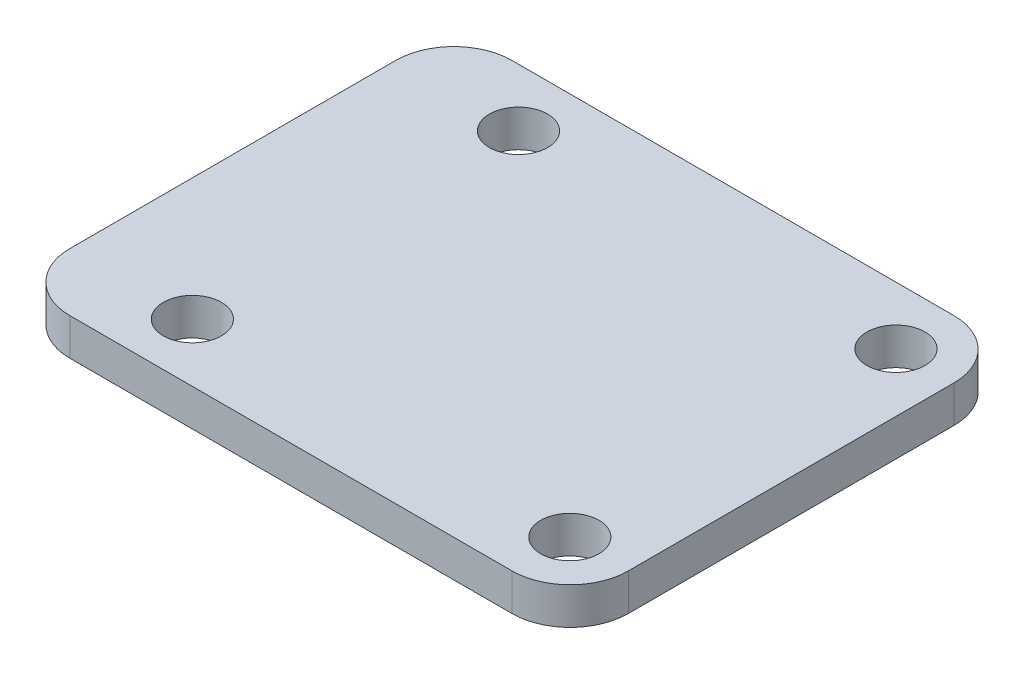
ISO-10303-21;
HEADER;
FILE_DESCRIPTION(('STEP AP214'),'2;1');
FILE_NAME('part.step','',(''),(''),'','','');
FILE_SCHEMA(('AUTOMOTIVE_DESIGN { 1 0 10303 214 1 1 1 1 }'));
ENDSEC;
DATA;
#1=APPLICATION_CONTEXT('core data for automotive mechanical design processes');
#2=APPLICATION_PROTOCOL_DEFINITION('international standard','automotive_design',2000,#1);
#3=PRODUCT_CONTEXT('',#1,'mechanical');
#4=PRODUCT('Part','Part','',(#3));
#5=PRODUCT_RELATED_PRODUCT_CATEGORY('part','',(#4));
#6=PRODUCT_DEFINITION_FORMATION('','',#4);
#7=PRODUCT_DEFINITION_CONTEXT('part definition',#1,'design');
#8=PRODUCT_DEFINITION('design','',#6,#7);
#9=PRODUCT_DEFINITION_SHAPE('','',#8);
#10=(LENGTH_UNIT() NAMED_UNIT(*) SI_UNIT(.MILLI.,.METRE.));
#11=(NAMED_UNIT(*) PLANE_ANGLE_UNIT() SI_UNIT($,.RADIAN.));
#12=(NAMED_UNIT(*) SI_UNIT($,.STERADIAN.) SOLID_ANGLE_UNIT());
#13=UNCERTAINTY_MEASURE_WITH_UNIT(LENGTH_MEASURE(1.E-05),#10,'distance_accuracy_value','');
#14=(GEOMETRIC_REPRESENTATION_CONTEXT(3) GLOBAL_UNCERTAINTY_ASSIGNED_CONTEXT((#13)) GLOBAL_UNIT_ASSIGNED_CONTEXT((#10,
#11,#12)) REPRESENTATION_CONTEXT('',''));
#15=CARTESIAN_POINT('',(0.,0.,0.));
#16=DIRECTION('',(0.,0.,1.));
#17=DIRECTION('',(1.,0.,0.));
#18=AXIS2_PLACEMENT_3D('',#15,#16,#17);
#19=CARTESIAN_POINT('',(12.,1.5875,9.5));
#20=DIRECTION('',(-1.,0.,0.));
#21=DIRECTION('',(0.,0.,1.));
#22=AXIS2_PLACEMENT_3D('',#19,#20,#21);
#23=PLANE('',#22);
#24=DIRECTION('',(0.,0.,-1.));
#25=VECTOR('',#24,1.);
#26=CARTESIAN_POINT('',(12.,0.,9.5));
#27=LINE('',#26,#25);
#28=CARTESIAN_POINT('',(12.,0.,7.));
#29=VERTEX_POINT('',#28);
#30=CARTESIAN_POINT('',(12.,0.,-7.));
#31=VERTEX_POINT('',#30);
#32=EDGE_CURVE('E131',#29,#31,#27,.T.);
#33=ORIENTED_EDGE('',*,*,#32,.T.);
#34=DIRECTION('',(0.,-1.,0.));
#35=VECTOR('',#34,1.);
#36=CARTESIAN_POINT('',(12.,1.5875,-7.));
#37=LINE('',#36,#35);
#38=CARTESIAN_POINT('',(12.,1.5875,-7.));
#39=VERTEX_POINT('',#38);
#40=EDGE_CURVE('E109',#31,#39,#37,.F.);
#41=ORIENTED_EDGE('',*,*,#40,.T.);
#42=DIRECTION('',(0.,0.,-1.));
#43=VECTOR('',#42,1.);
#44=CARTESIAN_POINT('',(12.,1.5875,9.5));
#45=LINE('',#44,#43);
#46=CARTESIAN_POINT('',(12.,1.5875,7.));
#47=VERTEX_POINT('',#46);
#48=EDGE_CURVE('E141',#47,#39,#45,.T.);
#49=ORIENTED_EDGE('',*,*,#48,.F.);
#50=DIRECTION('',(0.,-1.,0.));
#51=VECTOR('',#50,1.);
#52=CARTESIAN_POINT('',(12.,1.5875,7.));
#53=LINE('',#52,#51);
#54=EDGE_CURVE('E114',#47,#29,#53,.T.);
#55=ORIENTED_EDGE('',*,*,#54,.T.);
#56=EDGE_LOOP('',(#33,#41,#49,#55));
#57=FACE_BOUND('',#56,.T.);
#58=ADVANCED_FACE('F39',(#57),#23,.F.);
#59=CARTESIAN_POINT('',(-12.,1.5875,-9.5));
#60=DIRECTION('',(0.,0.,1.));
#61=DIRECTION('',(1.,0.,0.));
#62=AXIS2_PLACEMENT_3D('',#59,#60,#61);
#63=PLANE('',#62);
#64=DIRECTION('',(-1.,0.,0.));
#65=VECTOR('',#64,1.);
#66=CARTESIAN_POINT('',(-12.,1.5875,-9.5));
#67=LINE('',#66,#65);
#68=CARTESIAN_POINT('',(9.5,1.5875,-9.5));
#69=VERTEX_POINT('',#68);
#70=CARTESIAN_POINT('',(-9.5,1.5875,-9.5));
#71=VERTEX_POINT('',#70);
#72=EDGE_CURVE('E124',#69,#71,#67,.T.);
#73=ORIENTED_EDGE('',*,*,#72,.F.);
#74=DIRECTION('',(0.,-1.,0.));
#75=VECTOR('',#74,1.);
#76=CARTESIAN_POINT('',(9.5,1.5875,-9.5));
#77=LINE('',#76,#75);
#78=CARTESIAN_POINT('',(9.5,0.,-9.5));
#79=VERTEX_POINT('',#78);
#80=EDGE_CURVE('E108',#69,#79,#77,.T.);
#81=ORIENTED_EDGE('',*,*,#80,.T.);
#82=DIRECTION('',(-1.,0.,0.));
#83=VECTOR('',#82,1.);
#84=CARTESIAN_POINT('',(-12.,0.,-9.5));
#85=LINE('',#84,#83);
#86=CARTESIAN_POINT('',(-9.5,0.,-9.5));
#87=VERTEX_POINT('',#86);
#88=EDGE_CURVE('E121',#79,#87,#85,.T.);
#89=ORIENTED_EDGE('',*,*,#88,.T.);
#90=DIRECTION('',(0.,-1.,0.));
#91=VECTOR('',#90,1.);
#92=CARTESIAN_POINT('',(-9.5,1.5875,-9.5));
#93=LINE('',#92,#91);
#94=EDGE_CURVE('E126',#87,#71,#93,.F.);
#95=ORIENTED_EDGE('',*,*,#94,.T.);
#96=EDGE_LOOP('',(#73,#81,#89,#95));
#97=FACE_BOUND('',#96,.T.);
#98=ADVANCED_FACE('F120',(#97),#63,.F.);
#99=CARTESIAN_POINT('',(-12.,1.5875,9.5));
#100=DIRECTION('',(1.,0.,0.));
#101=DIRECTION('',(0.,0.,-1.));
#102=AXIS2_PLACEMENT_3D('',#99,#100,#101);
#103=PLANE('',#102);
#104=DIRECTION('',(0.,0.,1.));
#105=VECTOR('',#104,1.);
#106=CARTESIAN_POINT('',(-12.,1.5875,9.5));
#107=LINE('',#106,#105);
#108=CARTESIAN_POINT('',(-12.,1.5875,-7.));
#109=VERTEX_POINT('',#108);
#110=CARTESIAN_POINT('',(-12.,1.5875,7.));
#111=VERTEX_POINT('',#110);
#112=EDGE_CURVE('E175',#109,#111,#107,.T.);
#113=ORIENTED_EDGE('',*,*,#112,.F.);
#114=DIRECTION('',(0.,-1.,0.));
#115=VECTOR('',#114,1.);
#116=CARTESIAN_POINT('',(-12.,1.5875,-7.));
#117=LINE('',#116,#115);
#118=CARTESIAN_POINT('',(-12.,0.,-7.));
#119=VERTEX_POINT('',#118);
#120=EDGE_CURVE('E160',#109,#119,#117,.T.);
#121=ORIENTED_EDGE('',*,*,#120,.T.);
#122=DIRECTION('',(0.,0.,1.));
#123=VECTOR('',#122,1.);
#124=CARTESIAN_POINT('',(-12.,0.,9.5));
#125=LINE('',#124,#123);
#126=CARTESIAN_POINT('',(-12.,0.,7.));
#127=VERTEX_POINT('',#126);
#128=EDGE_CURVE('E130',#119,#127,#125,.T.);
#129=ORIENTED_EDGE('',*,*,#128,.T.);
#130=DIRECTION('',(0.,-1.,0.));
#131=VECTOR('',#130,1.);
#132=CARTESIAN_POINT('',(-12.,1.5875,7.));
#133=LINE('',#132,#131);
#134=EDGE_CURVE('E158',#127,#111,#133,.F.);
#135=ORIENTED_EDGE('',*,*,#134,.T.);
#136=EDGE_LOOP('',(#113,#121,#129,#135));
#137=FACE_BOUND('',#136,.T.);
#138=ADVANCED_FACE('F191',(#137),#103,.F.);
#139=CARTESIAN_POINT('',(-12.,1.5875,9.5));
#140=DIRECTION('',(0.,0.,-1.));
#141=DIRECTION('',(-1.,0.,0.));
#142=AXIS2_PLACEMENT_3D('',#139,#140,#141);
#143=PLANE('',#142);
#144=DIRECTION('',(1.,0.,0.));
#145=VECTOR('',#144,1.);
#146=CARTESIAN_POINT('',(-12.,0.,9.5));
#147=LINE('',#146,#145);
#148=CARTESIAN_POINT('',(-9.5,0.,9.5));
#149=VERTEX_POINT('',#148);
#150=CARTESIAN_POINT('',(9.5,0.,9.5));
#151=VERTEX_POINT('',#150);
#152=EDGE_CURVE('E134',#149,#151,#147,.T.);
#153=ORIENTED_EDGE('',*,*,#152,.T.);
#154=DIRECTION('',(0.,-1.,0.));
#155=VECTOR('',#154,1.);
#156=CARTESIAN_POINT('',(9.5,1.5875,9.5));
#157=LINE('',#156,#155);
#158=CARTESIAN_POINT('',(9.5,1.5875,9.5));
#159=VERTEX_POINT('',#158);
#160=EDGE_CURVE('E11',#151,#159,#157,.F.);
#161=ORIENTED_EDGE('',*,*,#160,.T.);
#162=DIRECTION('',(1.,0.,0.));
#163=VECTOR('',#162,1.);
#164=CARTESIAN_POINT('',(-12.,1.5875,9.5));
#165=LINE('',#164,#163);
#166=CARTESIAN_POINT('',(-9.5,1.5875,9.5));
#167=VERTEX_POINT('',#166);
#168=EDGE_CURVE('E142',#167,#159,#165,.T.);
#169=ORIENTED_EDGE('',*,*,#168,.F.);
#170=DIRECTION('',(0.,-1.,0.));
#171=VECTOR('',#170,1.);
#172=CARTESIAN_POINT('',(-9.5,1.5875,9.5));
#173=LINE('',#172,#171);
#174=EDGE_CURVE('E47',#167,#149,#173,.T.);
#175=ORIENTED_EDGE('',*,*,#174,.T.);
#176=EDGE_LOOP('',(#153,#161,#169,#175));
#177=FACE_BOUND('',#176,.T.);
#178=ADVANCED_FACE('F165',(#177),#143,.F.);
#179=CARTESIAN_POINT('',(0.,1.5875,0.));
#180=DIRECTION('',(0.,-1.,0.));
#181=DIRECTION('',(0.,0.,-1.));
#182=AXIS2_PLACEMENT_3D('',#179,#180,#181);
#183=PLANE('',#182);
#184=CARTESIAN_POINT('',(9.48229837082828,1.5875,-7.0207810188102));
#185=DIRECTION('',(0.,1.,0.));
#186=DIRECTION('',(0.,0.,1.));
#187=AXIS2_PLACEMENT_3D('',#184,#185,#186);
#188=CIRCLE('',#187,1.25);
#189=CARTESIAN_POINT('',(9.48229837082828,1.5875,-5.7707810188102));
#190=VERTEX_POINT('',#189);
#191=EDGE_CURVE('E310',#190,#190,#188,.T.);
#192=ORIENTED_EDGE('',*,*,#191,.F.);
#193=EDGE_LOOP('',(#192));
#194=FACE_BOUND('',#193,.T.);
#195=CARTESIAN_POINT('',(9.48229837082828,1.5875,6.99652961632725));
#196=DIRECTION('',(0.,1.,0.));
#197=DIRECTION('',(0.,0.,1.));
#198=AXIS2_PLACEMENT_3D('',#195,#196,#197);
#199=CIRCLE('',#198,1.25);
#200=CARTESIAN_POINT('',(9.48229837082828,1.5875,8.24652961632725));
#201=VERTEX_POINT('',#200);
#202=EDGE_CURVE('E315',#201,#201,#199,.T.);
#203=ORIENTED_EDGE('',*,*,#202,.F.);
#204=EDGE_LOOP('',(#203));
#205=FACE_BOUND('',#204,.T.);
#206=CARTESIAN_POINT('',(-6.74188989025642,1.5875,6.99652961632725));
#207=DIRECTION('',(0.,1.,0.));
#208=DIRECTION('',(0.,0.,1.));
#209=AXIS2_PLACEMENT_3D('',#206,#207,#208);
#210=CIRCLE('',#209,1.25);
#211=CARTESIAN_POINT('',(-6.74188989025642,1.5875,8.24652961632725));
#212=VERTEX_POINT('',#211);
#213=EDGE_CURVE('E323',#212,#212,#210,.T.);
#214=ORIENTED_EDGE('',*,*,#213,.F.);
#215=EDGE_LOOP('',(#214));
#216=FACE_BOUND('',#215,.T.);
#217=CARTESIAN_POINT('',(-6.74188989025642,1.5875,-7.0207810188102));
#218=DIRECTION('',(0.,1.,0.));
#219=DIRECTION('',(0.,0.,1.));
#220=AXIS2_PLACEMENT_3D('',#217,#218,#219);
#221=CIRCLE('',#220,1.25);
#222=CARTESIAN_POINT('',(-6.74188989025642,1.5875,-5.7707810188102));
#223=VERTEX_POINT('',#222);
#224=EDGE_CURVE('E178',#223,#223,#221,.T.);
#225=ORIENTED_EDGE('',*,*,#224,.F.);
#226=EDGE_LOOP('',(#225));
#227=FACE_BOUND('',#226,.T.);
#228=ORIENTED_EDGE('',*,*,#48,.T.);
#229=CARTESIAN_POINT('',(9.5,1.5875,-7.));
#230=DIRECTION('',(0.,-1.,0.));
#231=DIRECTION('',(0.,0.,-1.));
#232=AXIS2_PLACEMENT_3D('',#229,#230,#231);
#233=CIRCLE('',#232,2.5);
#234=EDGE_CURVE('E156',#39,#69,#233,.F.);
#235=ORIENTED_EDGE('',*,*,#234,.T.);
#236=ORIENTED_EDGE('',*,*,#72,.T.);
#237=CARTESIAN_POINT('',(-9.5,1.5875,-7.));
#238=DIRECTION('',(0.,-1.,0.));
#239=DIRECTION('',(0.,0.,-1.));
#240=AXIS2_PLACEMENT_3D('',#237,#238,#239);
#241=CIRCLE('',#240,2.5);
#242=EDGE_CURVE('E154',#71,#109,#241,.F.);
#243=ORIENTED_EDGE('',*,*,#242,.T.);
#244=ORIENTED_EDGE('',*,*,#112,.T.);
#245=CARTESIAN_POINT('',(-9.5,1.5875,7.));
#246=DIRECTION('',(0.,-1.,0.));
#247=DIRECTION('',(0.,0.,-1.));
#248=AXIS2_PLACEMENT_3D('',#245,#246,#247);
#249=CIRCLE('',#248,2.5);
#250=EDGE_CURVE('E59',#111,#167,#249,.F.);
#251=ORIENTED_EDGE('',*,*,#250,.T.);
#252=ORIENTED_EDGE('',*,*,#168,.T.);
#253=CARTESIAN_POINT('',(9.5,1.5875,7.));
#254=DIRECTION('',(0.,-1.,0.));
#255=DIRECTION('',(0.,0.,-1.));
#256=AXIS2_PLACEMENT_3D('',#253,#254,#255);
#257=CIRCLE('',#256,2.5);
#258=EDGE_CURVE('E152',#159,#47,#257,.F.);
#259=ORIENTED_EDGE('',*,*,#258,.T.);
#260=EDGE_LOOP('',(#228,#235,#236,#243,#244,#251,#252,#259));
#261=FACE_BOUND('',#260,.T.);
#262=ADVANCED_FACE('F181',(#194,#205,#216,#227,#261),#183,.F.);
#263=CARTESIAN_POINT('',(0.,0.,0.));
#264=DIRECTION('',(0.,-1.,0.));
#265=DIRECTION('',(0.,0.,-1.));
#266=AXIS2_PLACEMENT_3D('',#263,#264,#265);
#267=PLANE('',#266);
#268=CARTESIAN_POINT('',(9.48229837082828,0.,-7.0207810188102));
#269=DIRECTION('',(0.,1.,0.));
#270=DIRECTION('',(0.,0.,1.));
#271=AXIS2_PLACEMENT_3D('',#268,#269,#270);
#272=CIRCLE('',#271,1.25);
#273=CARTESIAN_POINT('',(9.48229837082828,0.,-5.7707810188102));
#274=VERTEX_POINT('',#273);
#275=EDGE_CURVE('E308',#274,#274,#272,.T.);
#276=ORIENTED_EDGE('',*,*,#275,.T.);
#277=EDGE_LOOP('',(#276));
#278=FACE_BOUND('',#277,.T.);
#279=CARTESIAN_POINT('',(9.48229837082828,0.,6.99652961632725));
#280=DIRECTION('',(0.,1.,0.));
#281=DIRECTION('',(0.,0.,1.));
#282=AXIS2_PLACEMENT_3D('',#279,#280,#281);
#283=CIRCLE('',#282,1.25);
#284=CARTESIAN_POINT('',(9.48229837082828,0.,8.24652961632725));
#285=VERTEX_POINT('',#284);
#286=EDGE_CURVE('E311',#285,#285,#283,.T.);
#287=ORIENTED_EDGE('',*,*,#286,.T.);
#288=EDGE_LOOP('',(#287));
#289=FACE_BOUND('',#288,.T.);
#290=CARTESIAN_POINT('',(-6.74188989025642,0.,6.99652961632725));
#291=DIRECTION('',(0.,1.,0.));
#292=DIRECTION('',(0.,0.,1.));
#293=AXIS2_PLACEMENT_3D('',#290,#291,#292);
#294=CIRCLE('',#293,1.25);
#295=CARTESIAN_POINT('',(-6.74188989025642,0.,8.24652961632725));
#296=VERTEX_POINT('',#295);
#297=EDGE_CURVE('E320',#296,#296,#294,.T.);
#298=ORIENTED_EDGE('',*,*,#297,.T.);
#299=EDGE_LOOP('',(#298));
#300=FACE_BOUND('',#299,.T.);
#301=CARTESIAN_POINT('',(-6.74188989025642,0.,-7.0207810188102));
#302=DIRECTION('',(0.,1.,0.));
#303=DIRECTION('',(0.,0.,1.));
#304=AXIS2_PLACEMENT_3D('',#301,#302,#303);
#305=CIRCLE('',#304,1.25);
#306=CARTESIAN_POINT('',(-6.74188989025642,0.,-5.7707810188102));
#307=VERTEX_POINT('',#306);
#308=EDGE_CURVE('E136',#307,#307,#305,.T.);
#309=ORIENTED_EDGE('',*,*,#308,.T.);
#310=EDGE_LOOP('',(#309));
#311=FACE_BOUND('',#310,.T.);
#312=ORIENTED_EDGE('',*,*,#88,.F.);
#313=CARTESIAN_POINT('',(9.5,0.,-7.));
#314=DIRECTION('',(0.,-1.,0.));
#315=DIRECTION('',(0.,0.,-1.));
#316=AXIS2_PLACEMENT_3D('',#313,#314,#315);
#317=CIRCLE('',#316,2.5);
#318=EDGE_CURVE('E104',#79,#31,#317,.T.);
#319=ORIENTED_EDGE('',*,*,#318,.T.);
#320=ORIENTED_EDGE('',*,*,#32,.F.);
#321=CARTESIAN_POINT('',(9.5,0.,7.));
#322=DIRECTION('',(0.,-1.,0.));
#323=DIRECTION('',(0.,0.,-1.));
#324=AXIS2_PLACEMENT_3D('',#321,#322,#323);
#325=CIRCLE('',#324,2.5);
#326=EDGE_CURVE('E145',#29,#151,#325,.T.);
#327=ORIENTED_EDGE('',*,*,#326,.T.);
#328=ORIENTED_EDGE('',*,*,#152,.F.);
#329=CARTESIAN_POINT('',(-9.5,0.,7.));
#330=DIRECTION('',(0.,-1.,0.));
#331=DIRECTION('',(0.,0.,-1.));
#332=AXIS2_PLACEMENT_3D('',#329,#330,#331);
#333=CIRCLE('',#332,2.5);
#334=EDGE_CURVE('E125',#149,#127,#333,.T.);
#335=ORIENTED_EDGE('',*,*,#334,.T.);
#336=ORIENTED_EDGE('',*,*,#128,.F.);
#337=CARTESIAN_POINT('',(-9.5,0.,-7.));
#338=DIRECTION('',(0.,-1.,0.));
#339=DIRECTION('',(0.,0.,-1.));
#340=AXIS2_PLACEMENT_3D('',#337,#338,#339);
#341=CIRCLE('',#340,2.5);
#342=EDGE_CURVE('E115',#119,#87,#341,.T.);
#343=ORIENTED_EDGE('',*,*,#342,.T.);
#344=EDGE_LOOP('',(#312,#319,#320,#327,#328,#335,#336,#343));
#345=FACE_BOUND('',#344,.T.);
#346=ADVANCED_FACE('F128',(#278,#289,#300,#311,#345),#267,.T.);
#347=CARTESIAN_POINT('',(9.5,1.5875,-7.));
#348=DIRECTION('',(0.,-1.,0.));
#349=DIRECTION('',(0.,0.,-1.));
#350=AXIS2_PLACEMENT_3D('',#347,#348,#349);
#351=CYLINDRICAL_SURFACE('',#350,2.5);
#352=ORIENTED_EDGE('',*,*,#234,.F.);
#353=ORIENTED_EDGE('',*,*,#40,.F.);
#354=ORIENTED_EDGE('',*,*,#318,.F.);
#355=ORIENTED_EDGE('',*,*,#80,.F.);
#356=EDGE_LOOP('',(#352,#353,#354,#355));
#357=FACE_BOUND('',#356,.T.);
#358=ADVANCED_FACE('F107',(#357),#351,.T.);
#359=CARTESIAN_POINT('',(-9.5,1.5875,-7.));
#360=DIRECTION('',(0.,-1.,0.));
#361=DIRECTION('',(0.,0.,-1.));
#362=AXIS2_PLACEMENT_3D('',#359,#360,#361);
#363=CYLINDRICAL_SURFACE('',#362,2.5);
#364=ORIENTED_EDGE('',*,*,#242,.F.);
#365=ORIENTED_EDGE('',*,*,#94,.F.);
#366=ORIENTED_EDGE('',*,*,#342,.F.);
#367=ORIENTED_EDGE('',*,*,#120,.F.);
#368=EDGE_LOOP('',(#364,#365,#366,#367));
#369=FACE_BOUND('',#368,.T.);
#370=ADVANCED_FACE('F206',(#369),#363,.T.);
#371=CARTESIAN_POINT('',(9.5,1.5875,7.));
#372=DIRECTION('',(0.,-1.,0.));
#373=DIRECTION('',(0.,0.,-1.));
#374=AXIS2_PLACEMENT_3D('',#371,#372,#373);
#375=CYLINDRICAL_SURFACE('',#374,2.5);
#376=ORIENTED_EDGE('',*,*,#258,.F.);
#377=ORIENTED_EDGE('',*,*,#160,.F.);
#378=ORIENTED_EDGE('',*,*,#326,.F.);
#379=ORIENTED_EDGE('',*,*,#54,.F.);
#380=EDGE_LOOP('',(#376,#377,#378,#379));
#381=FACE_BOUND('',#380,.T.);
#382=ADVANCED_FACE('F170',(#381),#375,.T.);
#383=CARTESIAN_POINT('',(-9.5,1.5875,7.));
#384=DIRECTION('',(0.,-1.,0.));
#385=DIRECTION('',(0.,0.,-1.));
#386=AXIS2_PLACEMENT_3D('',#383,#384,#385);
#387=CYLINDRICAL_SURFACE('',#386,2.5);
#388=ORIENTED_EDGE('',*,*,#250,.F.);
#389=ORIENTED_EDGE('',*,*,#134,.F.);
#390=ORIENTED_EDGE('',*,*,#334,.F.);
#391=ORIENTED_EDGE('',*,*,#174,.F.);
#392=EDGE_LOOP('',(#388,#389,#390,#391));
#393=FACE_BOUND('',#392,.T.);
#394=ADVANCED_FACE('F41',(#393),#387,.T.);
#395=CARTESIAN_POINT('',(-6.74188989025642,0.,-7.0207810188102));
#396=DIRECTION('',(0.,1.,0.));
#397=DIRECTION('',(0.,0.,1.));
#398=AXIS2_PLACEMENT_3D('',#395,#396,#397);
#399=CYLINDRICAL_SURFACE('',#398,1.25);
#400=ORIENTED_EDGE('',*,*,#308,.F.);
#401=EDGE_LOOP('',(#400));
#402=FACE_BOUND('',#401,.T.);
#403=ORIENTED_EDGE('',*,*,#224,.T.);
#404=EDGE_LOOP('',(#403));
#405=FACE_BOUND('',#404,.T.);
#406=ADVANCED_FACE('F213',(#402,#405),#399,.F.);
#407=CARTESIAN_POINT('',(-6.74188989025642,0.,6.99652961632725));
#408=DIRECTION('',(0.,1.,0.));
#409=DIRECTION('',(0.,0.,1.));
#410=AXIS2_PLACEMENT_3D('',#407,#408,#409);
#411=CYLINDRICAL_SURFACE('',#410,1.25);
#412=ORIENTED_EDGE('',*,*,#297,.F.);
#413=EDGE_LOOP('',(#412));
#414=FACE_BOUND('',#413,.T.);
#415=ORIENTED_EDGE('',*,*,#213,.T.);
#416=EDGE_LOOP('',(#415));
#417=FACE_BOUND('',#416,.T.);
#418=ADVANCED_FACE('F217',(#414,#417),#411,.F.);
#419=CARTESIAN_POINT('',(9.48229837082828,0.,6.99652961632725));
#420=DIRECTION('',(0.,1.,0.));
#421=DIRECTION('',(0.,0.,1.));
#422=AXIS2_PLACEMENT_3D('',#419,#420,#421);
#423=CYLINDRICAL_SURFACE('',#422,1.25);
#424=ORIENTED_EDGE('',*,*,#286,.F.);
#425=EDGE_LOOP('',(#424));
#426=FACE_BOUND('',#425,.T.);
#427=ORIENTED_EDGE('',*,*,#202,.T.);
#428=EDGE_LOOP('',(#427));
#429=FACE_BOUND('',#428,.T.);
#430=ADVANCED_FACE('F281',(#426,#429),#423,.F.);
#431=CARTESIAN_POINT('',(9.48229837082828,0.,-7.0207810188102));
#432=DIRECTION('',(0.,1.,0.));
#433=DIRECTION('',(0.,0.,1.));
#434=AXIS2_PLACEMENT_3D('',#431,#432,#433);
#435=CYLINDRICAL_SURFACE('',#434,1.25);
#436=ORIENTED_EDGE('',*,*,#275,.F.);
#437=EDGE_LOOP('',(#436));
#438=FACE_BOUND('',#437,.T.);
#439=ORIENTED_EDGE('',*,*,#191,.T.);
#440=EDGE_LOOP('',(#439));
#441=FACE_BOUND('',#440,.T.);
#442=ADVANCED_FACE('F291',(#438,#441),#435,.F.);
#443=CLOSED_SHELL('',(#58,#98,#138,#178,#262,#346,#358,#370,#382,#394,#406,#418,#430,#442));
#444=MANIFOLD_SOLID_BREP('B2',#443);
#445=ADVANCED_BREP_SHAPE_REPRESENTATION('',(#18,#444),#14);
#446=SHAPE_DEFINITION_REPRESENTATION(#9,#445);
ENDSEC;
END-ISO-10303-21;
